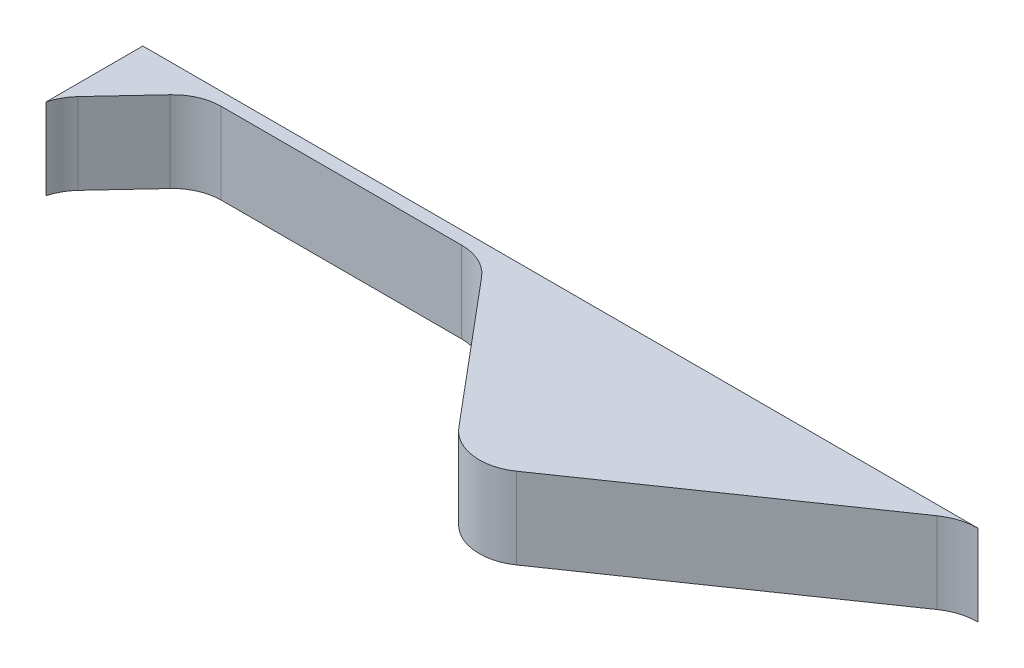
ISO-10303-21;
HEADER;
FILE_DESCRIPTION(('STEP AP214'),'2;1');
FILE_NAME('part.step','',(''),(''),'','','');
FILE_SCHEMA(('AUTOMOTIVE_DESIGN { 1 0 10303 214 1 1 1 1 }'));
ENDSEC;
DATA;
#1=APPLICATION_CONTEXT('core data for automotive mechanical design processes');
#2=APPLICATION_PROTOCOL_DEFINITION('international standard','automotive_design',2000,#1);
#3=PRODUCT_CONTEXT('',#1,'mechanical');
#4=PRODUCT('Part','Part','',(#3));
#5=PRODUCT_RELATED_PRODUCT_CATEGORY('part','',(#4));
#6=PRODUCT_DEFINITION_FORMATION('','',#4);
#7=PRODUCT_DEFINITION_CONTEXT('part definition',#1,'design');
#8=PRODUCT_DEFINITION('design','',#6,#7);
#9=PRODUCT_DEFINITION_SHAPE('','',#8);
#10=(LENGTH_UNIT() NAMED_UNIT(*) SI_UNIT(.MILLI.,.METRE.));
#11=(NAMED_UNIT(*) PLANE_ANGLE_UNIT() SI_UNIT($,.RADIAN.));
#12=(NAMED_UNIT(*) SI_UNIT($,.STERADIAN.) SOLID_ANGLE_UNIT());
#13=UNCERTAINTY_MEASURE_WITH_UNIT(LENGTH_MEASURE(1.E-05),#10,'distance_accuracy_value','');
#14=(GEOMETRIC_REPRESENTATION_CONTEXT(3) GLOBAL_UNCERTAINTY_ASSIGNED_CONTEXT((#13)) GLOBAL_UNIT_ASSIGNED_CONTEXT((#10,
#11,#12)) REPRESENTATION_CONTEXT('',''));
#15=CARTESIAN_POINT('',(0.,0.,0.));
#16=DIRECTION('',(0.,0.,1.));
#17=DIRECTION('',(1.,0.,0.));
#18=AXIS2_PLACEMENT_3D('',#15,#16,#17);
#19=CARTESIAN_POINT('',(3.68319943823685,6.35,0.974752223989142));
#20=DIRECTION('',(0.,-1.,0.));
#21=DIRECTION('',(0.,0.,-1.));
#22=AXIS2_PLACEMENT_3D('',#19,#20,#21);
#23=CYLINDRICAL_SURFACE('',#22,3.81);
#24=CARTESIAN_POINT('',(3.68319943823685,0.,0.974752223989142));
#25=DIRECTION('',(0.,-1.,0.));
#26=DIRECTION('',(0.,0.,1.));
#27=AXIS2_PLACEMENT_3D('',#24,#25,#26);
#28=CIRCLE('',#27,3.81);
#29=CARTESIAN_POINT('',(0.,0.,0.));
#30=VERTEX_POINT('',#29);
#31=CARTESIAN_POINT('',(0.896741835068071,0.,-1.62366152784926));
#32=VERTEX_POINT('',#31);
#33=EDGE_CURVE('E158',#30,#32,#28,.T.);
#34=ORIENTED_EDGE('',*,*,#33,.T.);
#35=DIRECTION('',(0.,-1.,0.));
#36=VECTOR('',#35,1.);
#37=CARTESIAN_POINT('',(0.896741835068071,6.35,-1.62366152784926));
#38=LINE('',#37,#36);
#39=CARTESIAN_POINT('',(0.896741835068071,6.35,-1.62366152784926));
#40=VERTEX_POINT('',#39);
#41=EDGE_CURVE('E11',#40,#32,#38,.T.);
#42=ORIENTED_EDGE('',*,*,#41,.F.);
#43=CARTESIAN_POINT('',(3.68319943823685,6.35,0.974752223989142));
#44=DIRECTION('',(0.,-1.,0.));
#45=DIRECTION('',(0.,0.,1.));
#46=AXIS2_PLACEMENT_3D('',#43,#44,#45);
#47=CIRCLE('',#46,3.81);
#48=CARTESIAN_POINT('',(0.,6.35,0.));
#49=VERTEX_POINT('',#48);
#50=EDGE_CURVE('E189',#49,#40,#47,.T.);
#51=ORIENTED_EDGE('',*,*,#50,.F.);
#52=DIRECTION('',(0.,-1.,0.));
#53=VECTOR('',#52,1.);
#54=CARTESIAN_POINT('',(0.,6.35,0.));
#55=LINE('',#54,#53);
#56=EDGE_CURVE('E154',#49,#30,#55,.T.);
#57=ORIENTED_EDGE('',*,*,#56,.T.);
#58=EDGE_LOOP('',(#34,#42,#51,#57));
#59=FACE_BOUND('',#58,.T.);
#60=ADVANCED_FACE('F39',(#59),#23,.F.);
#61=CARTESIAN_POINT('',(4.36129350418594,6.35,-5.33893833207429));
#62=DIRECTION('',(-0.731353701619101,0.,-0.681998360062573));
#63=DIRECTION('',(-0.681998360062573,0.,0.731353701619101));
#64=AXIS2_PLACEMENT_3D('',#61,#62,#63);
#65=PLANE('',#64);
#66=DIRECTION('',(0.681998360062573,0.,-0.731353701619101));
#67=VECTOR('',#66,1.);
#68=CARTESIAN_POINT('',(4.36129350418594,0.,-5.33893833207429));
#69=LINE('',#68,#67);
#70=CARTESIAN_POINT('',(4.36129350418595,0.,-5.3389383320743));
#71=VERTEX_POINT('',#70);
#72=EDGE_CURVE('E162',#32,#71,#69,.T.);
#73=ORIENTED_EDGE('',*,*,#72,.T.);
#74=DIRECTION('',(0.,-1.,0.));
#75=VECTOR('',#74,1.);
#76=CARTESIAN_POINT('',(4.36129350418595,6.35,-5.3389383320743));
#77=LINE('',#76,#75);
#78=CARTESIAN_POINT('',(4.36129350418595,6.35,-5.3389383320743));
#79=VERTEX_POINT('',#78);
#80=EDGE_CURVE('E48',#79,#71,#77,.T.);
#81=ORIENTED_EDGE('',*,*,#80,.F.);
#82=DIRECTION('',(0.681998360062573,0.,-0.731353701619101));
#83=VECTOR('',#82,1.);
#84=CARTESIAN_POINT('',(4.36129350418594,6.35,-5.33893833207429));
#85=LINE('',#84,#83);
#86=EDGE_CURVE('E108',#40,#79,#85,.T.);
#87=ORIENTED_EDGE('',*,*,#86,.F.);
#88=ORIENTED_EDGE('',*,*,#41,.T.);
#89=EDGE_LOOP('',(#73,#81,#87,#88));
#90=FACE_BOUND('',#89,.T.);
#91=ADVANCED_FACE('F275',(#90),#65,.F.);
#92=CARTESIAN_POINT('',(7.14775110735472,6.35,-2.74052458023589));
#93=DIRECTION('',(0.,-1.,0.));
#94=DIRECTION('',(0.,0.,-1.));
#95=AXIS2_PLACEMENT_3D('',#92,#93,#94);
#96=CYLINDRICAL_SURFACE('',#95,3.81);
#97=CARTESIAN_POINT('',(7.14775110735472,0.,-2.74052458023589));
#98=DIRECTION('',(0.,-1.,0.));
#99=DIRECTION('',(0.,0.,1.));
#100=AXIS2_PLACEMENT_3D('',#97,#98,#99);
#101=CIRCLE('',#100,3.81);
#102=CARTESIAN_POINT('',(7.14775110735472,0.,-6.55052458023589));
#103=VERTEX_POINT('',#102);
#104=EDGE_CURVE('E165',#71,#103,#101,.T.);
#105=ORIENTED_EDGE('',*,*,#104,.T.);
#106=DIRECTION('',(0.,-1.,0.));
#107=VECTOR('',#106,1.);
#108=CARTESIAN_POINT('',(7.14775110735472,6.35,-6.55052458023589));
#109=LINE('',#108,#107);
#110=CARTESIAN_POINT('',(7.14775110735472,6.35,-6.55052458023589));
#111=VERTEX_POINT('',#110);
#112=EDGE_CURVE('E212',#111,#103,#109,.T.);
#113=ORIENTED_EDGE('',*,*,#112,.F.);
#114=CARTESIAN_POINT('',(7.14775110735472,6.35,-2.74052458023589));
#115=DIRECTION('',(0.,-1.,0.));
#116=DIRECTION('',(0.,0.,1.));
#117=AXIS2_PLACEMENT_3D('',#114,#115,#116);
#118=CIRCLE('',#117,3.81);
#119=EDGE_CURVE('E222',#79,#111,#118,.T.);
#120=ORIENTED_EDGE('',*,*,#119,.F.);
#121=ORIENTED_EDGE('',*,*,#80,.T.);
#122=EDGE_LOOP('',(#105,#113,#120,#121));
#123=FACE_BOUND('',#122,.T.);
#124=ADVANCED_FACE('F220',(#123),#96,.F.);
#125=CARTESIAN_POINT('',(25.9437511073547,6.35,-6.55052458023589));
#126=DIRECTION('',(0.,0.,-1.));
#127=DIRECTION('',(-1.,0.,0.));
#128=AXIS2_PLACEMENT_3D('',#125,#126,#127);
#129=PLANE('',#128);
#130=DIRECTION('',(1.,0.,0.));
#131=VECTOR('',#130,1.);
#132=CARTESIAN_POINT('',(25.9437511073547,0.,-6.55052458023589));
#133=LINE('',#132,#131);
#134=CARTESIAN_POINT('',(25.9437511073547,0.,-6.55052458023589));
#135=VERTEX_POINT('',#134);
#136=EDGE_CURVE('E168',#103,#135,#133,.T.);
#137=ORIENTED_EDGE('',*,*,#136,.T.);
#138=DIRECTION('',(0.,-1.,0.));
#139=VECTOR('',#138,1.);
#140=CARTESIAN_POINT('',(25.9437511073547,6.35,-6.55052458023589));
#141=LINE('',#140,#139);
#142=CARTESIAN_POINT('',(25.9437511073547,6.35,-6.55052458023589));
#143=VERTEX_POINT('',#142);
#144=EDGE_CURVE('E208',#143,#135,#141,.T.);
#145=ORIENTED_EDGE('',*,*,#144,.F.);
#146=DIRECTION('',(1.,0.,0.));
#147=VECTOR('',#146,1.);
#148=CARTESIAN_POINT('',(25.9437511073547,6.35,-6.55052458023589));
#149=LINE('',#148,#147);
#150=EDGE_CURVE('E241',#111,#143,#149,.T.);
#151=ORIENTED_EDGE('',*,*,#150,.F.);
#152=ORIENTED_EDGE('',*,*,#112,.T.);
#153=EDGE_LOOP('',(#137,#145,#151,#152));
#154=FACE_BOUND('',#153,.T.);
#155=ADVANCED_FACE('F231',(#154),#129,.F.);
#156=CARTESIAN_POINT('',(25.9437511073547,6.35,-2.74052458023589));
#157=DIRECTION('',(0.,-1.,0.));
#158=DIRECTION('',(0.,0.,-1.));
#159=AXIS2_PLACEMENT_3D('',#156,#157,#158);
#160=CYLINDRICAL_SURFACE('',#159,3.81);
#161=CARTESIAN_POINT('',(25.9437511073547,0.,-2.74052458023589));
#162=DIRECTION('',(0.,-1.,0.));
#163=DIRECTION('',(0.,0.,1.));
#164=AXIS2_PLACEMENT_3D('',#161,#162,#163);
#165=CIRCLE('',#164,3.81);
#166=CARTESIAN_POINT('',(28.8623804356378,0.,-5.18954537314187));
#167=VERTEX_POINT('',#166);
#168=EDGE_CURVE('E171',#135,#167,#165,.T.);
#169=ORIENTED_EDGE('',*,*,#168,.T.);
#170=DIRECTION('',(0.,-1.,0.));
#171=VECTOR('',#170,1.);
#172=CARTESIAN_POINT('',(28.8623804356378,6.35,-5.18954537314187));
#173=LINE('',#172,#171);
#174=CARTESIAN_POINT('',(28.8623804356378,6.35,-5.18954537314187));
#175=VERTEX_POINT('',#174);
#176=EDGE_CURVE('E204',#175,#167,#173,.T.);
#177=ORIENTED_EDGE('',*,*,#176,.F.);
#178=CARTESIAN_POINT('',(25.9437511073547,6.35,-2.74052458023589));
#179=DIRECTION('',(0.,-1.,0.));
#180=DIRECTION('',(0.,0.,1.));
#181=AXIS2_PLACEMENT_3D('',#178,#179,#180);
#182=CIRCLE('',#181,3.81);
#183=EDGE_CURVE('E237',#143,#175,#182,.T.);
#184=ORIENTED_EDGE('',*,*,#183,.F.);
#185=ORIENTED_EDGE('',*,*,#144,.T.);
#186=EDGE_LOOP('',(#169,#177,#184,#185));
#187=FACE_BOUND('',#186,.T.);
#188=ADVANCED_FACE('F235',(#187),#160,.F.);
#189=CARTESIAN_POINT('',(38.1686594486805,6.35,5.90124607433385));
#190=DIRECTION('',(0.76604444311892,0.,-0.642787609686609));
#191=DIRECTION('',(-0.642787609686609,0.,-0.76604444311892));
#192=AXIS2_PLACEMENT_3D('',#189,#190,#191);
#193=PLANE('',#192);
#194=DIRECTION('',(0.642787609686609,0.,0.76604444311892));
#195=VECTOR('',#194,1.);
#196=CARTESIAN_POINT('',(38.1686594486805,0.,5.90124607433385));
#197=LINE('',#196,#195);
#198=CARTESIAN_POINT('',(38.1686594486805,0.,5.90124607433385));
#199=VERTEX_POINT('',#198);
#200=EDGE_CURVE('E174',#167,#199,#197,.T.);
#201=ORIENTED_EDGE('',*,*,#200,.T.);
#202=DIRECTION('',(0.,-1.,0.));
#203=VECTOR('',#202,1.);
#204=CARTESIAN_POINT('',(38.1686594486805,6.35,5.90124607433385));
#205=LINE('',#204,#203);
#206=CARTESIAN_POINT('',(38.1686594486805,6.35,5.90124607433385));
#207=VERTEX_POINT('',#206);
#208=EDGE_CURVE('E200',#207,#199,#205,.T.);
#209=ORIENTED_EDGE('',*,*,#208,.F.);
#210=DIRECTION('',(0.642787609686609,0.,0.76604444311892));
#211=VECTOR('',#210,1.);
#212=CARTESIAN_POINT('',(38.1686594486805,6.35,5.90124607433385));
#213=LINE('',#212,#211);
#214=EDGE_CURVE('E240',#175,#207,#213,.T.);
#215=ORIENTED_EDGE('',*,*,#214,.F.);
#216=ORIENTED_EDGE('',*,*,#176,.T.);
#217=EDGE_LOOP('',(#201,#209,#215,#216));
#218=FACE_BOUND('',#217,.T.);
#219=ADVANCED_FACE('F288',(#218),#193,.F.);
#220=CARTESIAN_POINT('',(41.1626074606067,6.35,3.38902540176218));
#221=DIRECTION('',(0.,-1.,0.));
#222=DIRECTION('',(0.,0.,-1.));
#223=AXIS2_PLACEMENT_3D('',#220,#221,#222);
#224=CYLINDRICAL_SURFACE('',#223,3.90832155865062);
#225=CARTESIAN_POINT('',(41.1626074606067,0.,3.38902540176218));
#226=DIRECTION('',(0.,1.,0.));
#227=DIRECTION('',(0.,0.,-1.));
#228=AXIS2_PLACEMENT_3D('',#225,#226,#227);
#229=CIRCLE('',#228,3.90832155865062);
#230=CARTESIAN_POINT('',(43.3819234113434,0.,6.6061070166142));
#231=VERTEX_POINT('',#230);
#232=EDGE_CURVE('E177',#199,#231,#229,.T.);
#233=ORIENTED_EDGE('',*,*,#232,.T.);
#234=DIRECTION('',(0.,-1.,0.));
#235=VECTOR('',#234,1.);
#236=CARTESIAN_POINT('',(43.3819234113434,6.35,6.6061070166142));
#237=LINE('',#236,#235);
#238=CARTESIAN_POINT('',(43.3819234113434,6.35,6.6061070166142));
#239=VERTEX_POINT('',#238);
#240=EDGE_CURVE('E196',#239,#231,#237,.T.);
#241=ORIENTED_EDGE('',*,*,#240,.F.);
#242=CARTESIAN_POINT('',(41.1626074606067,6.35,3.38902540176218));
#243=DIRECTION('',(0.,1.,0.));
#244=DIRECTION('',(0.,0.,-1.));
#245=AXIS2_PLACEMENT_3D('',#242,#243,#244);
#246=CIRCLE('',#245,3.90832155865062);
#247=EDGE_CURVE('E245',#207,#239,#246,.T.);
#248=ORIENTED_EDGE('',*,*,#247,.F.);
#249=ORIENTED_EDGE('',*,*,#208,.T.);
#250=EDGE_LOOP('',(#233,#241,#248,#249));
#251=FACE_BOUND('',#250,.T.);
#252=ADVANCED_FACE('F256',(#251),#224,.T.);
#253=CARTESIAN_POINT('',(62.8260507088609,6.35,-6.80749792903467));
#254=DIRECTION('',(-0.567843745053292,0.,-0.82313636853431));
#255=DIRECTION('',(-0.82313636853431,0.,0.567843745053292));
#256=AXIS2_PLACEMENT_3D('',#253,#254,#255);
#257=PLANE('',#256);
#258=DIRECTION('',(0.82313636853431,0.,-0.567843745053292));
#259=VECTOR('',#258,1.);
#260=CARTESIAN_POINT('',(62.8260507088609,0.,-6.80749792903467));
#261=LINE('',#260,#259);
#262=CARTESIAN_POINT('',(62.8260507088609,0.,-6.80749792903466));
#263=VERTEX_POINT('',#262);
#264=EDGE_CURVE('E180',#231,#263,#261,.T.);
#265=ORIENTED_EDGE('',*,*,#264,.T.);
#266=DIRECTION('',(0.,-1.,0.));
#267=VECTOR('',#266,1.);
#268=CARTESIAN_POINT('',(62.8260507088609,6.35,-6.80749792903466));
#269=LINE('',#268,#267);
#270=CARTESIAN_POINT('',(62.8260507088609,6.35,-6.80749792903466));
#271=VERTEX_POINT('',#270);
#272=EDGE_CURVE('E147',#271,#263,#269,.T.);
#273=ORIENTED_EDGE('',*,*,#272,.F.);
#274=DIRECTION('',(0.82313636853431,0.,-0.567843745053292));
#275=VECTOR('',#274,1.);
#276=CARTESIAN_POINT('',(62.8260507088609,6.35,-6.80749792903467));
#277=LINE('',#276,#275);
#278=EDGE_CURVE('E136',#239,#271,#277,.T.);
#279=ORIENTED_EDGE('',*,*,#278,.F.);
#280=ORIENTED_EDGE('',*,*,#240,.T.);
#281=EDGE_LOOP('',(#265,#273,#279,#280));
#282=FACE_BOUND('',#281,.T.);
#283=ADVANCED_FACE('F260',(#282),#257,.F.);
#284=CARTESIAN_POINT('',(65.278000000001,6.35,-3.25319508970351));
#285=DIRECTION('',(0.,-1.,0.));
#286=DIRECTION('',(0.,0.,-1.));
#287=AXIS2_PLACEMENT_3D('',#284,#285,#286);
#288=CYLINDRICAL_SURFACE('',#287,4.318);
#289=CARTESIAN_POINT('',(65.278000000001,0.,-3.25319508970351));
#290=DIRECTION('',(0.,-1.,0.));
#291=DIRECTION('',(0.,0.,-1.));
#292=AXIS2_PLACEMENT_3D('',#289,#290,#291);
#293=CIRCLE('',#292,4.318);
#294=CARTESIAN_POINT('',(65.278,0.,-7.57119508970351));
#295=VERTEX_POINT('',#294);
#296=EDGE_CURVE('E145',#263,#295,#293,.T.);
#297=ORIENTED_EDGE('',*,*,#296,.T.);
#298=DIRECTION('',(0.,-1.,0.));
#299=VECTOR('',#298,1.);
#300=CARTESIAN_POINT('',(65.278,6.35,-7.57119508970351));
#301=LINE('',#300,#299);
#302=CARTESIAN_POINT('',(65.278,6.35,-7.57119508970351));
#303=VERTEX_POINT('',#302);
#304=EDGE_CURVE('E142',#303,#295,#301,.T.);
#305=ORIENTED_EDGE('',*,*,#304,.F.);
#306=CARTESIAN_POINT('',(65.278000000001,6.35,-3.25319508970351));
#307=DIRECTION('',(0.,-1.,0.));
#308=DIRECTION('',(0.,0.,-1.));
#309=AXIS2_PLACEMENT_3D('',#306,#307,#308);
#310=CIRCLE('',#309,4.318);
#311=EDGE_CURVE('E130',#271,#303,#310,.T.);
#312=ORIENTED_EDGE('',*,*,#311,.F.);
#313=ORIENTED_EDGE('',*,*,#272,.T.);
#314=EDGE_LOOP('',(#297,#305,#312,#313));
#315=FACE_BOUND('',#314,.T.);
#316=ADVANCED_FACE('F143',(#315),#288,.F.);
#317=CARTESIAN_POINT('',(0.,6.35,-7.57119508970351));
#318=DIRECTION('',(0.,0.,1.));
#319=DIRECTION('',(1.,0.,0.));
#320=AXIS2_PLACEMENT_3D('',#317,#318,#319);
#321=PLANE('',#320);
#322=DIRECTION('',(-1.,0.,0.));
#323=VECTOR('',#322,1.);
#324=CARTESIAN_POINT('',(0.,0.,-7.57119508970351));
#325=LINE('',#324,#323);
#326=CARTESIAN_POINT('',(0.,0.,-7.57119508970351));
#327=VERTEX_POINT('',#326);
#328=EDGE_CURVE('E94',#295,#327,#325,.T.);
#329=ORIENTED_EDGE('',*,*,#328,.T.);
#330=DIRECTION('',(0.,-1.,0.));
#331=VECTOR('',#330,1.);
#332=CARTESIAN_POINT('',(0.,6.35,-7.57119508970351));
#333=LINE('',#332,#331);
#334=CARTESIAN_POINT('',(0.,6.35,-7.57119508970351));
#335=VERTEX_POINT('',#334);
#336=EDGE_CURVE('E148',#335,#327,#333,.T.);
#337=ORIENTED_EDGE('',*,*,#336,.F.);
#338=DIRECTION('',(-1.,0.,0.));
#339=VECTOR('',#338,1.);
#340=CARTESIAN_POINT('',(0.,6.35,-7.57119508970351));
#341=LINE('',#340,#339);
#342=EDGE_CURVE('E134',#303,#335,#341,.T.);
#343=ORIENTED_EDGE('',*,*,#342,.F.);
#344=ORIENTED_EDGE('',*,*,#304,.T.);
#345=EDGE_LOOP('',(#329,#337,#343,#344));
#346=FACE_BOUND('',#345,.T.);
#347=ADVANCED_FACE('F150',(#346),#321,.F.);
#348=CARTESIAN_POINT('',(0.,6.35,0.));
#349=DIRECTION('',(1.,0.,0.));
#350=DIRECTION('',(0.,0.,-1.));
#351=AXIS2_PLACEMENT_3D('',#348,#349,#350);
#352=PLANE('',#351);
#353=DIRECTION('',(0.,0.,1.));
#354=VECTOR('',#353,1.);
#355=CARTESIAN_POINT('',(0.,0.,0.));
#356=LINE('',#355,#354);
#357=EDGE_CURVE('E100',#327,#30,#356,.T.);
#358=ORIENTED_EDGE('',*,*,#357,.T.);
#359=ORIENTED_EDGE('',*,*,#56,.F.);
#360=DIRECTION('',(0.,0.,1.));
#361=VECTOR('',#360,1.);
#362=CARTESIAN_POINT('',(0.,6.35,0.));
#363=LINE('',#362,#361);
#364=EDGE_CURVE('E56',#335,#49,#363,.T.);
#365=ORIENTED_EDGE('',*,*,#364,.F.);
#366=ORIENTED_EDGE('',*,*,#336,.T.);
#367=EDGE_LOOP('',(#358,#359,#365,#366));
#368=FACE_BOUND('',#367,.T.);
#369=ADVANCED_FACE('F264',(#368),#352,.F.);
#370=CARTESIAN_POINT('',(3.68319943823685,6.35,0.974752223989142));
#371=DIRECTION('',(0.,1.,0.));
#372=DIRECTION('',(0.,0.,1.));
#373=AXIS2_PLACEMENT_3D('',#370,#371,#372);
#374=PLANE('',#373);
#375=ORIENTED_EDGE('',*,*,#50,.T.);
#376=ORIENTED_EDGE('',*,*,#86,.T.);
#377=ORIENTED_EDGE('',*,*,#119,.T.);
#378=ORIENTED_EDGE('',*,*,#150,.T.);
#379=ORIENTED_EDGE('',*,*,#183,.T.);
#380=ORIENTED_EDGE('',*,*,#214,.T.);
#381=ORIENTED_EDGE('',*,*,#247,.T.);
#382=ORIENTED_EDGE('',*,*,#278,.T.);
#383=ORIENTED_EDGE('',*,*,#311,.T.);
#384=ORIENTED_EDGE('',*,*,#342,.T.);
#385=ORIENTED_EDGE('',*,*,#364,.T.);
#386=EDGE_LOOP('',(#375,#376,#377,#378,#379,#380,#381,#382,#383,#384,#385));
#387=FACE_BOUND('',#386,.T.);
#388=ADVANCED_FACE('F132',(#387),#374,.T.);
#389=CARTESIAN_POINT('',(3.68319943823685,0.,0.974752223989142));
#390=DIRECTION('',(0.,1.,0.));
#391=DIRECTION('',(0.,0.,1.));
#392=AXIS2_PLACEMENT_3D('',#389,#390,#391);
#393=PLANE('',#392);
#394=ORIENTED_EDGE('',*,*,#33,.F.);
#395=ORIENTED_EDGE('',*,*,#357,.F.);
#396=ORIENTED_EDGE('',*,*,#328,.F.);
#397=ORIENTED_EDGE('',*,*,#296,.F.);
#398=ORIENTED_EDGE('',*,*,#264,.F.);
#399=ORIENTED_EDGE('',*,*,#232,.F.);
#400=ORIENTED_EDGE('',*,*,#200,.F.);
#401=ORIENTED_EDGE('',*,*,#168,.F.);
#402=ORIENTED_EDGE('',*,*,#136,.F.);
#403=ORIENTED_EDGE('',*,*,#104,.F.);
#404=ORIENTED_EDGE('',*,*,#72,.F.);
#405=EDGE_LOOP('',(#394,#395,#396,#397,#398,#399,#400,#401,#402,#403,#404));
#406=FACE_BOUND('',#405,.T.);
#407=ADVANCED_FACE('F226',(#406),#393,.F.);
#408=CLOSED_SHELL('',(#60,#91,#124,#155,#188,#219,#252,#283,#316,#347,#369,#388,#407));
#409=MANIFOLD_SOLID_BREP('B2',#408);
#410=ADVANCED_BREP_SHAPE_REPRESENTATION('',(#18,#409),#14);
#411=SHAPE_DEFINITION_REPRESENTATION(#9,#410);
ENDSEC;
END-ISO-10303-21;
